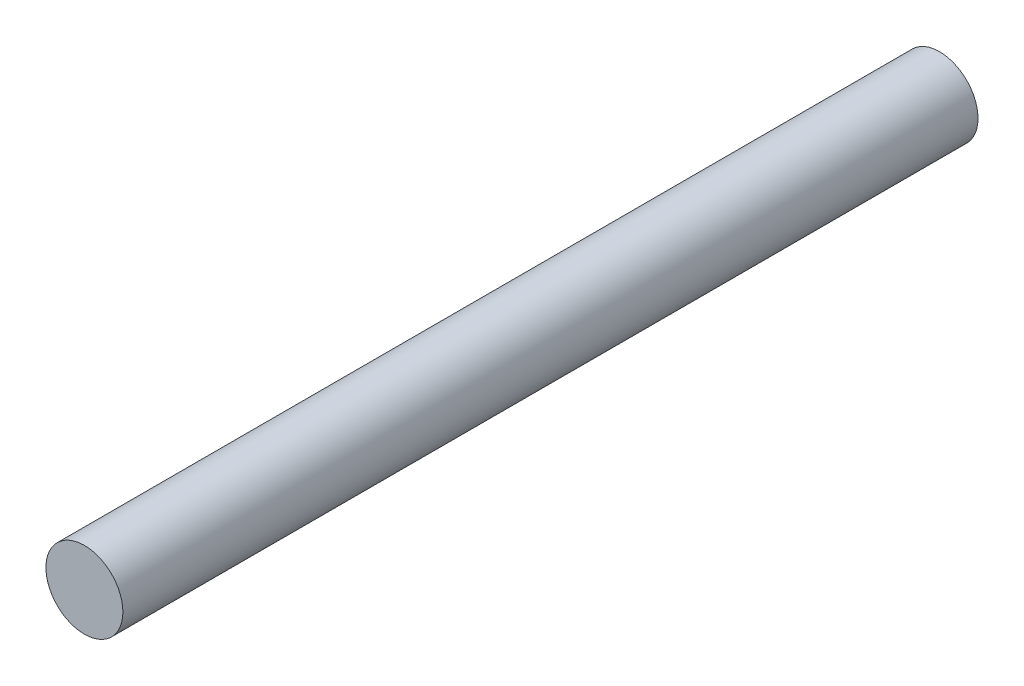
ISO-10303-21;
HEADER;
FILE_DESCRIPTION(('STEP AP214'),'2;1');
FILE_NAME('part.step','',(''),(''),'','','');
FILE_SCHEMA(('AUTOMOTIVE_DESIGN { 1 0 10303 214 1 1 1 1 }'));
ENDSEC;
DATA;
#1=APPLICATION_CONTEXT('core data for automotive mechanical design processes');
#2=APPLICATION_PROTOCOL_DEFINITION('international standard','automotive_design',2000,#1);
#3=PRODUCT_CONTEXT('',#1,'mechanical');
#4=PRODUCT('Part','Part','',(#3));
#5=PRODUCT_RELATED_PRODUCT_CATEGORY('part','',(#4));
#6=PRODUCT_DEFINITION_FORMATION('','',#4);
#7=PRODUCT_DEFINITION_CONTEXT('part definition',#1,'design');
#8=PRODUCT_DEFINITION('design','',#6,#7);
#9=PRODUCT_DEFINITION_SHAPE('','',#8);
#10=(LENGTH_UNIT() NAMED_UNIT(*) SI_UNIT(.MILLI.,.METRE.));
#11=(NAMED_UNIT(*) PLANE_ANGLE_UNIT() SI_UNIT($,.RADIAN.));
#12=(NAMED_UNIT(*) SI_UNIT($,.STERADIAN.) SOLID_ANGLE_UNIT());
#13=UNCERTAINTY_MEASURE_WITH_UNIT(LENGTH_MEASURE(1.E-05),#10,'distance_accuracy_value','');
#14=(GEOMETRIC_REPRESENTATION_CONTEXT(3) GLOBAL_UNCERTAINTY_ASSIGNED_CONTEXT((#13)) GLOBAL_UNIT_ASSIGNED_CONTEXT((#10,
#11,#12)) REPRESENTATION_CONTEXT('',''));
#15=CARTESIAN_POINT('',(0.,0.,0.));
#16=DIRECTION('',(0.,0.,1.));
#17=DIRECTION('',(1.,0.,0.));
#18=AXIS2_PLACEMENT_3D('',#15,#16,#17);
#19=CARTESIAN_POINT('',(0.,0.,20.));
#20=DIRECTION('',(0.,0.,-1.));
#21=DIRECTION('',(-1.,0.,0.));
#22=AXIS2_PLACEMENT_3D('',#19,#20,#21);
#23=CYLINDRICAL_SURFACE('',#22,0.9);
#24=CARTESIAN_POINT('',(0.,0.,20.));
#25=DIRECTION('',(0.,0.,1.));
#26=DIRECTION('',(1.,0.,0.));
#27=AXIS2_PLACEMENT_3D('',#24,#25,#26);
#28=CIRCLE('',#27,0.9);
#29=CARTESIAN_POINT('',(0.9,0.,20.));
#30=VERTEX_POINT('',#29);
#31=EDGE_CURVE('E10',#30,#30,#28,.T.);
#32=ORIENTED_EDGE('',*,*,#31,.F.);
#33=EDGE_LOOP('',(#32));
#34=FACE_BOUND('',#33,.T.);
#35=CARTESIAN_POINT('',(0.,0.,0.));
#36=DIRECTION('',(0.,0.,1.));
#37=DIRECTION('',(1.,0.,0.));
#38=AXIS2_PLACEMENT_3D('',#35,#36,#37);
#39=CIRCLE('',#38,0.9);
#40=CARTESIAN_POINT('',(0.9,0.,0.));
#41=VERTEX_POINT('',#40);
#42=EDGE_CURVE('E42',#41,#41,#39,.T.);
#43=ORIENTED_EDGE('',*,*,#42,.T.);
#44=EDGE_LOOP('',(#43));
#45=FACE_BOUND('',#44,.T.);
#46=ADVANCED_FACE('F39',(#34,#45),#23,.T.);
#47=CARTESIAN_POINT('',(0.,0.,20.));
#48=DIRECTION('',(0.,0.,1.));
#49=DIRECTION('',(1.,0.,0.));
#50=AXIS2_PLACEMENT_3D('',#47,#48,#49);
#51=PLANE('',#50);
#52=ORIENTED_EDGE('',*,*,#31,.T.);
#53=EDGE_LOOP('',(#52));
#54=FACE_BOUND('',#53,.T.);
#55=ADVANCED_FACE('F54',(#54),#51,.T.);
#56=CARTESIAN_POINT('',(0.,0.,0.));
#57=DIRECTION('',(0.,0.,1.));
#58=DIRECTION('',(1.,0.,0.));
#59=AXIS2_PLACEMENT_3D('',#56,#57,#58);
#60=PLANE('',#59);
#61=ORIENTED_EDGE('',*,*,#42,.F.);
#62=EDGE_LOOP('',(#61));
#63=FACE_BOUND('',#62,.T.);
#64=ADVANCED_FACE('F52',(#63),#60,.F.);
#65=CLOSED_SHELL('',(#46,#55,#64));
#66=MANIFOLD_SOLID_BREP('B2',#65);
#67=ADVANCED_BREP_SHAPE_REPRESENTATION('',(#18,#66),#14);
#68=SHAPE_DEFINITION_REPRESENTATION(#9,#67);
ENDSEC;
END-ISO-10303-21;
